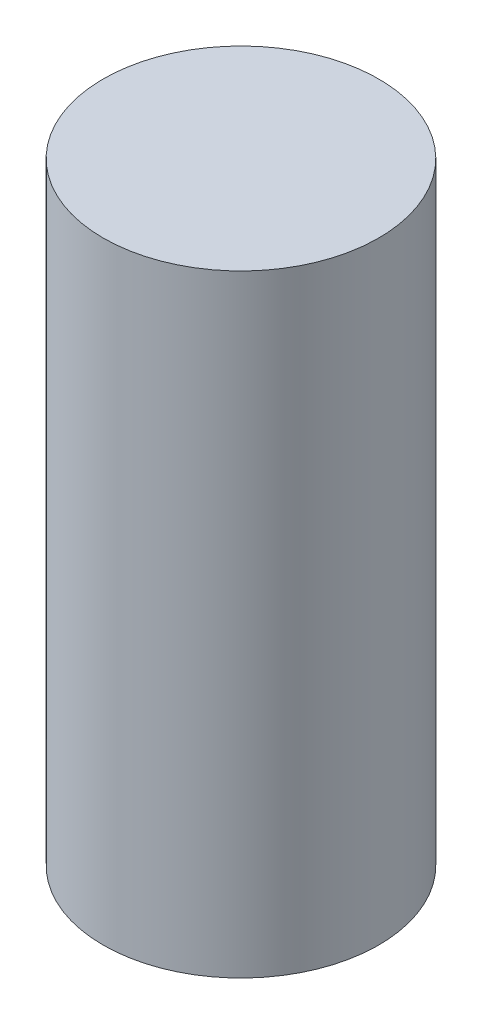
ISO-10303-21;
HEADER;
FILE_DESCRIPTION(('STEP AP214'),'2;1');
FILE_NAME('part.step','',(''),(''),'','','');
FILE_SCHEMA(('AUTOMOTIVE_DESIGN { 1 0 10303 214 1 1 1 1 }'));
ENDSEC;
DATA;
#1=APPLICATION_CONTEXT('core data for automotive mechanical design processes');
#2=APPLICATION_PROTOCOL_DEFINITION('international standard','automotive_design',2000,#1);
#3=PRODUCT_CONTEXT('',#1,'mechanical');
#4=PRODUCT('Part','Part','',(#3));
#5=PRODUCT_RELATED_PRODUCT_CATEGORY('part','',(#4));
#6=PRODUCT_DEFINITION_FORMATION('','',#4);
#7=PRODUCT_DEFINITION_CONTEXT('part definition',#1,'design');
#8=PRODUCT_DEFINITION('design','',#6,#7);
#9=PRODUCT_DEFINITION_SHAPE('','',#8);
#10=(LENGTH_UNIT() NAMED_UNIT(*) SI_UNIT(.MILLI.,.METRE.));
#11=(NAMED_UNIT(*) PLANE_ANGLE_UNIT() SI_UNIT($,.RADIAN.));
#12=(NAMED_UNIT(*) SI_UNIT($,.STERADIAN.) SOLID_ANGLE_UNIT());
#13=UNCERTAINTY_MEASURE_WITH_UNIT(LENGTH_MEASURE(1.E-05),#10,'distance_accuracy_value','');
#14=(GEOMETRIC_REPRESENTATION_CONTEXT(3) GLOBAL_UNCERTAINTY_ASSIGNED_CONTEXT((#13)) GLOBAL_UNIT_ASSIGNED_CONTEXT((#10,
#11,#12)) REPRESENTATION_CONTEXT('',''));
#15=CARTESIAN_POINT('',(0.,0.,0.));
#16=DIRECTION('',(0.,0.,1.));
#17=DIRECTION('',(1.,0.,0.));
#18=AXIS2_PLACEMENT_3D('',#15,#16,#17);
#19=CARTESIAN_POINT('',(0.,22.,0.));
#20=DIRECTION('',(0.,-1.,0.));
#21=DIRECTION('',(0.,0.,-1.));
#22=AXIS2_PLACEMENT_3D('',#19,#20,#21);
#23=CYLINDRICAL_SURFACE('',#22,4.95);
#24=CARTESIAN_POINT('',(0.,22.,0.));
#25=DIRECTION('',(0.,1.,0.));
#26=DIRECTION('',(0.,0.,1.));
#27=AXIS2_PLACEMENT_3D('',#24,#25,#26);
#28=CIRCLE('',#27,4.95);
#29=CARTESIAN_POINT('',(0.,22.,4.95));
#30=VERTEX_POINT('',#29);
#31=EDGE_CURVE('E10',#30,#30,#28,.T.);
#32=ORIENTED_EDGE('',*,*,#31,.F.);
#33=EDGE_LOOP('',(#32));
#34=FACE_BOUND('',#33,.T.);
#35=CARTESIAN_POINT('',(0.,0.,0.));
#36=DIRECTION('',(0.,1.,0.));
#37=DIRECTION('',(0.,0.,1.));
#38=AXIS2_PLACEMENT_3D('',#35,#36,#37);
#39=CIRCLE('',#38,4.95);
#40=CARTESIAN_POINT('',(0.,0.,4.95));
#41=VERTEX_POINT('',#40);
#42=EDGE_CURVE('E46',#41,#41,#39,.T.);
#43=ORIENTED_EDGE('',*,*,#42,.T.);
#44=EDGE_LOOP('',(#43));
#45=FACE_BOUND('',#44,.T.);
#46=ADVANCED_FACE('F43',(#34,#45),#23,.T.);
#47=CARTESIAN_POINT('',(0.,22.,0.));
#48=DIRECTION('',(0.,1.,0.));
#49=DIRECTION('',(0.,0.,1.));
#50=AXIS2_PLACEMENT_3D('',#47,#48,#49);
#51=PLANE('',#50);
#52=ORIENTED_EDGE('',*,*,#31,.T.);
#53=EDGE_LOOP('',(#52));
#54=FACE_BOUND('',#53,.T.);
#55=ADVANCED_FACE('F60',(#54),#51,.T.);
#56=CARTESIAN_POINT('',(0.,0.,0.));
#57=DIRECTION('',(0.,1.,0.));
#58=DIRECTION('',(0.,0.,1.));
#59=AXIS2_PLACEMENT_3D('',#56,#57,#58);
#60=PLANE('',#59);
#61=ORIENTED_EDGE('',*,*,#42,.F.);
#62=EDGE_LOOP('',(#61));
#63=FACE_BOUND('',#62,.T.);
#64=ADVANCED_FACE('F58',(#63),#60,.F.);
#65=CLOSED_SHELL('',(#46,#55,#64));
#66=MANIFOLD_SOLID_BREP('B2',#65);
#67=ADVANCED_BREP_SHAPE_REPRESENTATION('',(#18,#66),#14);
#68=SHAPE_DEFINITION_REPRESENTATION(#9,#67);
ENDSEC;
END-ISO-10303-21;
